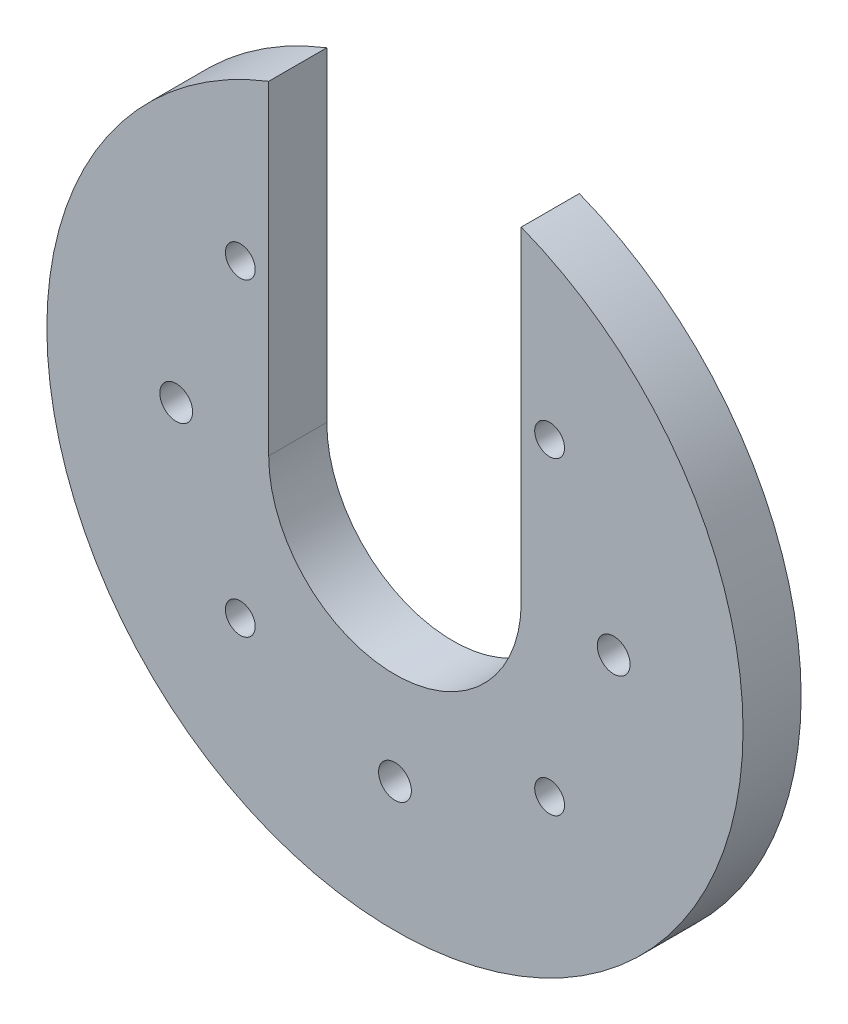
ISO-10303-21;
HEADER;
FILE_DESCRIPTION(('STEP AP214'),'2;1');
FILE_NAME('part.step','',(''),(''),'','','');
FILE_SCHEMA(('AUTOMOTIVE_DESIGN { 1 0 10303 214 1 1 1 1 }'));
ENDSEC;
DATA;
#1=APPLICATION_CONTEXT('core data for automotive mechanical design processes');
#2=APPLICATION_PROTOCOL_DEFINITION('international standard','automotive_design',2000,#1);
#3=PRODUCT_CONTEXT('',#1,'mechanical');
#4=PRODUCT('Part','Part','',(#3));
#5=PRODUCT_RELATED_PRODUCT_CATEGORY('part','',(#4));
#6=PRODUCT_DEFINITION_FORMATION('','',#4);
#7=PRODUCT_DEFINITION_CONTEXT('part definition',#1,'design');
#8=PRODUCT_DEFINITION('design','',#6,#7);
#9=PRODUCT_DEFINITION_SHAPE('','',#8);
#10=(LENGTH_UNIT() NAMED_UNIT(*) SI_UNIT(.MILLI.,.METRE.));
#11=(NAMED_UNIT(*) PLANE_ANGLE_UNIT() SI_UNIT($,.RADIAN.));
#12=(NAMED_UNIT(*) SI_UNIT($,.STERADIAN.) SOLID_ANGLE_UNIT());
#13=UNCERTAINTY_MEASURE_WITH_UNIT(LENGTH_MEASURE(1.E-05),#10,'distance_accuracy_value','');
#14=(GEOMETRIC_REPRESENTATION_CONTEXT(3) GLOBAL_UNCERTAINTY_ASSIGNED_CONTEXT((#13)) GLOBAL_UNIT_ASSIGNED_CONTEXT((#10,
#11,#12)) REPRESENTATION_CONTEXT('',''));
#15=CARTESIAN_POINT('',(0.,0.,0.));
#16=DIRECTION('',(0.,0.,1.));
#17=DIRECTION('',(1.,0.,0.));
#18=AXIS2_PLACEMENT_3D('',#15,#16,#17);
#19=CARTESIAN_POINT('',(0.,0.,5.842));
#20=DIRECTION('',(0.,0.,-1.));
#21=DIRECTION('',(-1.,0.,0.));
#22=AXIS2_PLACEMENT_3D('',#19,#20,#21);
#23=CYLINDRICAL_SURFACE('',#22,12.7);
#24=CARTESIAN_POINT('',(0.,0.,0.));
#25=DIRECTION('',(0.,0.,1.));
#26=DIRECTION('',(1.,0.,0.));
#27=AXIS2_PLACEMENT_3D('',#24,#25,#26);
#28=CIRCLE('',#27,12.7);
#29=CARTESIAN_POINT('',(-12.7,0.,0.));
#30=VERTEX_POINT('',#29);
#31=CARTESIAN_POINT('',(12.7,0.,0.));
#32=VERTEX_POINT('',#31);
#33=EDGE_CURVE('E106',#30,#32,#28,.T.);
#34=ORIENTED_EDGE('',*,*,#33,.F.);
#35=DIRECTION('',(0.,0.,-1.));
#36=VECTOR('',#35,1.);
#37=CARTESIAN_POINT('',(-12.7,0.,5.842));
#38=LINE('',#37,#36);
#39=CARTESIAN_POINT('',(-12.7,0.,5.842));
#40=VERTEX_POINT('',#39);
#41=EDGE_CURVE('E11',#40,#30,#38,.T.);
#42=ORIENTED_EDGE('',*,*,#41,.F.);
#43=CARTESIAN_POINT('',(0.,0.,5.842));
#44=DIRECTION('',(0.,0.,1.));
#45=DIRECTION('',(1.,0.,0.));
#46=AXIS2_PLACEMENT_3D('',#43,#44,#45);
#47=CIRCLE('',#46,12.7);
#48=CARTESIAN_POINT('',(12.7,0.,5.842));
#49=VERTEX_POINT('',#48);
#50=EDGE_CURVE('E90',#40,#49,#47,.T.);
#51=ORIENTED_EDGE('',*,*,#50,.T.);
#52=DIRECTION('',(0.,0.,-1.));
#53=VECTOR('',#52,1.);
#54=CARTESIAN_POINT('',(12.7,0.,5.842));
#55=LINE('',#54,#53);
#56=EDGE_CURVE('E52',#49,#32,#55,.T.);
#57=ORIENTED_EDGE('',*,*,#56,.T.);
#58=EDGE_LOOP('',(#34,#42,#51,#57));
#59=FACE_BOUND('',#58,.T.);
#60=ADVANCED_FACE('F35',(#59),#23,.F.);
#61=CARTESIAN_POINT('',(-12.7,0.,5.842));
#62=DIRECTION('',(-1.,0.,0.));
#63=DIRECTION('',(0.,0.,1.));
#64=AXIS2_PLACEMENT_3D('',#61,#62,#63);
#65=PLANE('',#64);
#66=DIRECTION('',(0.,1.,0.));
#67=VECTOR('',#66,1.);
#68=CARTESIAN_POINT('',(-12.7,0.,0.));
#69=LINE('',#68,#67);
#70=CARTESIAN_POINT('',(-12.7,32.6294834959121,0.));
#71=VERTEX_POINT('',#70);
#72=EDGE_CURVE('E95',#30,#71,#69,.T.);
#73=ORIENTED_EDGE('',*,*,#72,.T.);
#74=DIRECTION('',(0.,0.,-1.));
#75=VECTOR('',#74,1.);
#76=CARTESIAN_POINT('',(-12.7,32.6294834959121,5.842));
#77=LINE('',#76,#75);
#78=CARTESIAN_POINT('',(-12.7,32.6294834959121,5.842));
#79=VERTEX_POINT('',#78);
#80=EDGE_CURVE('E44',#79,#71,#77,.T.);
#81=ORIENTED_EDGE('',*,*,#80,.F.);
#82=DIRECTION('',(0.,1.,0.));
#83=VECTOR('',#82,1.);
#84=CARTESIAN_POINT('',(-12.7,0.,5.842));
#85=LINE('',#84,#83);
#86=EDGE_CURVE('E86',#40,#79,#85,.T.);
#87=ORIENTED_EDGE('',*,*,#86,.F.);
#88=ORIENTED_EDGE('',*,*,#41,.T.);
#89=EDGE_LOOP('',(#73,#81,#87,#88));
#90=FACE_BOUND('',#89,.T.);
#91=ADVANCED_FACE('F93',(#90),#65,.F.);
#92=CARTESIAN_POINT('',(0.,0.,5.842));
#93=DIRECTION('',(0.,0.,-1.));
#94=DIRECTION('',(-1.,0.,0.));
#95=AXIS2_PLACEMENT_3D('',#92,#93,#94);
#96=CYLINDRICAL_SURFACE('',#95,35.0139);
#97=CARTESIAN_POINT('',(0.,0.,0.));
#98=DIRECTION('',(0.,0.,1.));
#99=DIRECTION('',(1.,0.,0.));
#100=AXIS2_PLACEMENT_3D('',#97,#98,#99);
#101=CIRCLE('',#100,35.0139);
#102=CARTESIAN_POINT('',(12.7,32.6294834959121,0.));
#103=VERTEX_POINT('',#102);
#104=EDGE_CURVE('E103',#71,#103,#101,.T.);
#105=ORIENTED_EDGE('',*,*,#104,.T.);
#106=DIRECTION('',(0.,0.,-1.));
#107=VECTOR('',#106,1.);
#108=CARTESIAN_POINT('',(12.7,32.6294834959121,5.842));
#109=LINE('',#108,#107);
#110=CARTESIAN_POINT('',(12.7,32.6294834959121,5.842));
#111=VERTEX_POINT('',#110);
#112=EDGE_CURVE('E66',#111,#103,#109,.T.);
#113=ORIENTED_EDGE('',*,*,#112,.F.);
#114=CARTESIAN_POINT('',(0.,0.,5.842));
#115=DIRECTION('',(0.,0.,1.));
#116=DIRECTION('',(1.,0.,0.));
#117=AXIS2_PLACEMENT_3D('',#114,#115,#116);
#118=CIRCLE('',#117,35.0139);
#119=EDGE_CURVE('E78',#79,#111,#118,.T.);
#120=ORIENTED_EDGE('',*,*,#119,.F.);
#121=ORIENTED_EDGE('',*,*,#80,.T.);
#122=EDGE_LOOP('',(#105,#113,#120,#121));
#123=FACE_BOUND('',#122,.T.);
#124=ADVANCED_FACE('F80',(#123),#96,.T.);
#125=CARTESIAN_POINT('',(22.,0.,5.842));
#126=DIRECTION('',(0.,0.,-1.));
#127=DIRECTION('',(-1.,0.,0.));
#128=AXIS2_PLACEMENT_3D('',#125,#126,#127);
#129=CYLINDRICAL_SURFACE('',#128,1.65);
#130=CARTESIAN_POINT('',(22.,0.,5.842));
#131=DIRECTION('',(0.,0.,1.));
#132=DIRECTION('',(1.,0.,0.));
#133=AXIS2_PLACEMENT_3D('',#130,#131,#132);
#134=CIRCLE('',#133,1.65);
#135=CARTESIAN_POINT('',(23.65,0.,5.842));
#136=VERTEX_POINT('',#135);
#137=EDGE_CURVE('E120',#136,#136,#134,.T.);
#138=ORIENTED_EDGE('',*,*,#137,.T.);
#139=EDGE_LOOP('',(#138));
#140=FACE_BOUND('',#139,.T.);
#141=CARTESIAN_POINT('',(22.,0.,0.));
#142=DIRECTION('',(0.,0.,1.));
#143=DIRECTION('',(1.,0.,0.));
#144=AXIS2_PLACEMENT_3D('',#141,#142,#143);
#145=CIRCLE('',#144,1.65);
#146=CARTESIAN_POINT('',(23.65,0.,0.));
#147=VERTEX_POINT('',#146);
#148=EDGE_CURVE('E108',#147,#147,#145,.T.);
#149=ORIENTED_EDGE('',*,*,#148,.F.);
#150=EDGE_LOOP('',(#149));
#151=FACE_BOUND('',#150,.T.);
#152=ADVANCED_FACE('F178',(#140,#151),#129,.F.);
#153=CARTESIAN_POINT('',(0.,-22.,5.842));
#154=DIRECTION('',(0.,0.,-1.));
#155=DIRECTION('',(-1.,0.,0.));
#156=AXIS2_PLACEMENT_3D('',#153,#154,#155);
#157=CYLINDRICAL_SURFACE('',#156,1.65);
#158=CARTESIAN_POINT('',(0.,-22.,5.842));
#159=DIRECTION('',(0.,0.,1.));
#160=DIRECTION('',(1.,0.,0.));
#161=AXIS2_PLACEMENT_3D('',#158,#159,#160);
#162=CIRCLE('',#161,1.65);
#163=CARTESIAN_POINT('',(1.65,-22.,5.842));
#164=VERTEX_POINT('',#163);
#165=EDGE_CURVE('E123',#164,#164,#162,.T.);
#166=ORIENTED_EDGE('',*,*,#165,.T.);
#167=EDGE_LOOP('',(#166));
#168=FACE_BOUND('',#167,.T.);
#169=CARTESIAN_POINT('',(0.,-22.,0.));
#170=DIRECTION('',(0.,0.,1.));
#171=DIRECTION('',(1.,0.,0.));
#172=AXIS2_PLACEMENT_3D('',#169,#170,#171);
#173=CIRCLE('',#172,1.65);
#174=CARTESIAN_POINT('',(1.65,-22.,0.));
#175=VERTEX_POINT('',#174);
#176=EDGE_CURVE('E111',#175,#175,#173,.T.);
#177=ORIENTED_EDGE('',*,*,#176,.F.);
#178=EDGE_LOOP('',(#177));
#179=FACE_BOUND('',#178,.T.);
#180=ADVANCED_FACE('F181',(#168,#179),#157,.F.);
#181=CARTESIAN_POINT('',(-22.,0.,5.842));
#182=DIRECTION('',(0.,0.,-1.));
#183=DIRECTION('',(-1.,0.,0.));
#184=AXIS2_PLACEMENT_3D('',#181,#182,#183);
#185=CYLINDRICAL_SURFACE('',#184,1.65);
#186=CARTESIAN_POINT('',(-22.,0.,5.842));
#187=DIRECTION('',(0.,0.,1.));
#188=DIRECTION('',(1.,0.,0.));
#189=AXIS2_PLACEMENT_3D('',#186,#187,#188);
#190=CIRCLE('',#189,1.65);
#191=CARTESIAN_POINT('',(-20.35,0.,5.842));
#192=VERTEX_POINT('',#191);
#193=EDGE_CURVE('E102',#192,#192,#190,.T.);
#194=ORIENTED_EDGE('',*,*,#193,.T.);
#195=EDGE_LOOP('',(#194));
#196=FACE_BOUND('',#195,.T.);
#197=CARTESIAN_POINT('',(-22.,0.,0.));
#198=DIRECTION('',(0.,0.,1.));
#199=DIRECTION('',(1.,0.,0.));
#200=AXIS2_PLACEMENT_3D('',#197,#198,#199);
#201=CIRCLE('',#200,1.65);
#202=CARTESIAN_POINT('',(-20.35,0.,0.));
#203=VERTEX_POINT('',#202);
#204=EDGE_CURVE('E114',#203,#203,#201,.T.);
#205=ORIENTED_EDGE('',*,*,#204,.F.);
#206=EDGE_LOOP('',(#205));
#207=FACE_BOUND('',#206,.T.);
#208=ADVANCED_FACE('F37',(#196,#207),#185,.F.);
#209=CARTESIAN_POINT('',(12.7,0.,5.842));
#210=DIRECTION('',(-1.,0.,0.));
#211=DIRECTION('',(0.,0.,1.));
#212=AXIS2_PLACEMENT_3D('',#209,#210,#211);
#213=PLANE('',#212);
#214=DIRECTION('',(0.,1.,0.));
#215=VECTOR('',#214,1.);
#216=CARTESIAN_POINT('',(12.7,0.,0.));
#217=LINE('',#216,#215);
#218=EDGE_CURVE('E99',#32,#103,#217,.T.);
#219=ORIENTED_EDGE('',*,*,#218,.F.);
#220=ORIENTED_EDGE('',*,*,#56,.F.);
#221=DIRECTION('',(0.,1.,0.));
#222=VECTOR('',#221,1.);
#223=CARTESIAN_POINT('',(12.7,0.,5.842));
#224=LINE('',#223,#222);
#225=EDGE_CURVE('E85',#49,#111,#224,.T.);
#226=ORIENTED_EDGE('',*,*,#225,.T.);
#227=ORIENTED_EDGE('',*,*,#112,.T.);
#228=EDGE_LOOP('',(#219,#220,#226,#227));
#229=FACE_BOUND('',#228,.T.);
#230=ADVANCED_FACE('F164',(#229),#213,.T.);
#231=CARTESIAN_POINT('',(0.,0.,5.842));
#232=DIRECTION('',(0.,0.,1.));
#233=DIRECTION('',(1.,0.,0.));
#234=AXIS2_PLACEMENT_3D('',#231,#232,#233);
#235=PLANE('',#234);
#236=CARTESIAN_POINT('',(15.5563491861041,-15.556349186104,5.842));
#237=DIRECTION('',(0.,0.,1.));
#238=DIRECTION('',(1.,0.,0.));
#239=AXIS2_PLACEMENT_3D('',#236,#237,#238);
#240=CIRCLE('',#239,1.5);
#241=CARTESIAN_POINT('',(17.0563491861041,-15.556349186104,5.842));
#242=VERTEX_POINT('',#241);
#243=EDGE_CURVE('E146',#242,#242,#240,.T.);
#244=ORIENTED_EDGE('',*,*,#243,.F.);
#245=EDGE_LOOP('',(#244));
#246=FACE_BOUND('',#245,.T.);
#247=CARTESIAN_POINT('',(15.556349186104,15.5563491861041,5.842));
#248=DIRECTION('',(0.,0.,1.));
#249=DIRECTION('',(1.,0.,0.));
#250=AXIS2_PLACEMENT_3D('',#247,#248,#249);
#251=CIRCLE('',#250,1.5);
#252=CARTESIAN_POINT('',(17.056349186104,15.5563491861041,5.842));
#253=VERTEX_POINT('',#252);
#254=EDGE_CURVE('E140',#253,#253,#251,.T.);
#255=ORIENTED_EDGE('',*,*,#254,.F.);
#256=EDGE_LOOP('',(#255));
#257=FACE_BOUND('',#256,.T.);
#258=CARTESIAN_POINT('',(-15.5563491861041,15.556349186104,5.842));
#259=DIRECTION('',(0.,0.,1.));
#260=DIRECTION('',(1.,0.,0.));
#261=AXIS2_PLACEMENT_3D('',#258,#259,#260);
#262=CIRCLE('',#261,1.5);
#263=CARTESIAN_POINT('',(-14.0563491861041,15.556349186104,5.842));
#264=VERTEX_POINT('',#263);
#265=EDGE_CURVE('E134',#264,#264,#262,.T.);
#266=ORIENTED_EDGE('',*,*,#265,.F.);
#267=EDGE_LOOP('',(#266));
#268=FACE_BOUND('',#267,.T.);
#269=CARTESIAN_POINT('',(-15.556349186104,-15.5563491861041,5.842));
#270=DIRECTION('',(0.,0.,1.));
#271=DIRECTION('',(1.,0.,0.));
#272=AXIS2_PLACEMENT_3D('',#269,#270,#271);
#273=CIRCLE('',#272,1.5);
#274=CARTESIAN_POINT('',(-14.056349186104,-15.5563491861041,5.842));
#275=VERTEX_POINT('',#274);
#276=EDGE_CURVE('E128',#275,#275,#273,.T.);
#277=ORIENTED_EDGE('',*,*,#276,.F.);
#278=EDGE_LOOP('',(#277));
#279=FACE_BOUND('',#278,.T.);
#280=ORIENTED_EDGE('',*,*,#193,.F.);
#281=EDGE_LOOP('',(#280));
#282=FACE_BOUND('',#281,.T.);
#283=ORIENTED_EDGE('',*,*,#165,.F.);
#284=EDGE_LOOP('',(#283));
#285=FACE_BOUND('',#284,.T.);
#286=ORIENTED_EDGE('',*,*,#137,.F.);
#287=EDGE_LOOP('',(#286));
#288=FACE_BOUND('',#287,.T.);
#289=ORIENTED_EDGE('',*,*,#50,.F.);
#290=ORIENTED_EDGE('',*,*,#86,.T.);
#291=ORIENTED_EDGE('',*,*,#119,.T.);
#292=ORIENTED_EDGE('',*,*,#225,.F.);
#293=EDGE_LOOP('',(#289,#290,#291,#292));
#294=FACE_BOUND('',#293,.T.);
#295=ADVANCED_FACE('F89',(#246,#257,#268,#279,#282,#285,#288,#294),#235,.T.);
#296=CARTESIAN_POINT('',(0.,0.,0.));
#297=DIRECTION('',(0.,0.,1.));
#298=DIRECTION('',(1.,0.,0.));
#299=AXIS2_PLACEMENT_3D('',#296,#297,#298);
#300=PLANE('',#299);
#301=CARTESIAN_POINT('',(15.5563491861041,-15.556349186104,0.));
#302=DIRECTION('',(0.,0.,1.));
#303=DIRECTION('',(1.,0.,0.));
#304=AXIS2_PLACEMENT_3D('',#301,#302,#303);
#305=CIRCLE('',#304,1.5);
#306=CARTESIAN_POINT('',(17.0563491861041,-15.556349186104,0.));
#307=VERTEX_POINT('',#306);
#308=EDGE_CURVE('E143',#307,#307,#305,.T.);
#309=ORIENTED_EDGE('',*,*,#308,.T.);
#310=EDGE_LOOP('',(#309));
#311=FACE_BOUND('',#310,.T.);
#312=CARTESIAN_POINT('',(15.556349186104,15.5563491861041,0.));
#313=DIRECTION('',(0.,0.,1.));
#314=DIRECTION('',(1.,0.,0.));
#315=AXIS2_PLACEMENT_3D('',#312,#313,#314);
#316=CIRCLE('',#315,1.5);
#317=CARTESIAN_POINT('',(17.056349186104,15.5563491861041,0.));
#318=VERTEX_POINT('',#317);
#319=EDGE_CURVE('E137',#318,#318,#316,.T.);
#320=ORIENTED_EDGE('',*,*,#319,.T.);
#321=EDGE_LOOP('',(#320));
#322=FACE_BOUND('',#321,.T.);
#323=CARTESIAN_POINT('',(-15.5563491861041,15.556349186104,0.));
#324=DIRECTION('',(0.,0.,1.));
#325=DIRECTION('',(1.,0.,0.));
#326=AXIS2_PLACEMENT_3D('',#323,#324,#325);
#327=CIRCLE('',#326,1.5);
#328=CARTESIAN_POINT('',(-14.0563491861041,15.556349186104,0.));
#329=VERTEX_POINT('',#328);
#330=EDGE_CURVE('E131',#329,#329,#327,.T.);
#331=ORIENTED_EDGE('',*,*,#330,.T.);
#332=EDGE_LOOP('',(#331));
#333=FACE_BOUND('',#332,.T.);
#334=CARTESIAN_POINT('',(-15.556349186104,-15.5563491861041,0.));
#335=DIRECTION('',(0.,0.,1.));
#336=DIRECTION('',(1.,0.,0.));
#337=AXIS2_PLACEMENT_3D('',#334,#335,#336);
#338=CIRCLE('',#337,1.5);
#339=CARTESIAN_POINT('',(-14.056349186104,-15.5563491861041,0.));
#340=VERTEX_POINT('',#339);
#341=EDGE_CURVE('E117',#340,#340,#338,.T.);
#342=ORIENTED_EDGE('',*,*,#341,.T.);
#343=EDGE_LOOP('',(#342));
#344=FACE_BOUND('',#343,.T.);
#345=ORIENTED_EDGE('',*,*,#204,.T.);
#346=EDGE_LOOP('',(#345));
#347=FACE_BOUND('',#346,.T.);
#348=ORIENTED_EDGE('',*,*,#176,.T.);
#349=EDGE_LOOP('',(#348));
#350=FACE_BOUND('',#349,.T.);
#351=ORIENTED_EDGE('',*,*,#148,.T.);
#352=EDGE_LOOP('',(#351));
#353=FACE_BOUND('',#352,.T.);
#354=ORIENTED_EDGE('',*,*,#33,.T.);
#355=ORIENTED_EDGE('',*,*,#218,.T.);
#356=ORIENTED_EDGE('',*,*,#104,.F.);
#357=ORIENTED_EDGE('',*,*,#72,.F.);
#358=EDGE_LOOP('',(#354,#355,#356,#357));
#359=FACE_BOUND('',#358,.T.);
#360=ADVANCED_FACE('F152',(#311,#322,#333,#344,#347,#350,#353,#359),#300,.F.);
#361=CARTESIAN_POINT('',(-15.556349186104,-15.5563491861041,0.));
#362=DIRECTION('',(0.,0.,1.));
#363=DIRECTION('',(1.,0.,0.));
#364=AXIS2_PLACEMENT_3D('',#361,#362,#363);
#365=CYLINDRICAL_SURFACE('',#364,1.5);
#366=ORIENTED_EDGE('',*,*,#341,.F.);
#367=EDGE_LOOP('',(#366));
#368=FACE_BOUND('',#367,.T.);
#369=ORIENTED_EDGE('',*,*,#276,.T.);
#370=EDGE_LOOP('',(#369));
#371=FACE_BOUND('',#370,.T.);
#372=ADVANCED_FACE('F187',(#368,#371),#365,.F.);
#373=CARTESIAN_POINT('',(-15.5563491861041,15.556349186104,0.));
#374=DIRECTION('',(0.,0.,1.));
#375=DIRECTION('',(1.,0.,0.));
#376=AXIS2_PLACEMENT_3D('',#373,#374,#375);
#377=CYLINDRICAL_SURFACE('',#376,1.5);
#378=ORIENTED_EDGE('',*,*,#330,.F.);
#379=EDGE_LOOP('',(#378));
#380=FACE_BOUND('',#379,.T.);
#381=ORIENTED_EDGE('',*,*,#265,.T.);
#382=EDGE_LOOP('',(#381));
#383=FACE_BOUND('',#382,.T.);
#384=ADVANCED_FACE('F241',(#380,#383),#377,.F.);
#385=CARTESIAN_POINT('',(15.556349186104,15.5563491861041,0.));
#386=DIRECTION('',(0.,0.,1.));
#387=DIRECTION('',(1.,0.,0.));
#388=AXIS2_PLACEMENT_3D('',#385,#386,#387);
#389=CYLINDRICAL_SURFACE('',#388,1.5);
#390=ORIENTED_EDGE('',*,*,#319,.F.);
#391=EDGE_LOOP('',(#390));
#392=FACE_BOUND('',#391,.T.);
#393=ORIENTED_EDGE('',*,*,#254,.T.);
#394=EDGE_LOOP('',(#393));
#395=FACE_BOUND('',#394,.T.);
#396=ADVANCED_FACE('F158',(#392,#395),#389,.F.);
#397=CARTESIAN_POINT('',(15.5563491861041,-15.556349186104,0.));
#398=DIRECTION('',(0.,0.,1.));
#399=DIRECTION('',(1.,0.,0.));
#400=AXIS2_PLACEMENT_3D('',#397,#398,#399);
#401=CYLINDRICAL_SURFACE('',#400,1.5);
#402=ORIENTED_EDGE('',*,*,#308,.F.);
#403=EDGE_LOOP('',(#402));
#404=FACE_BOUND('',#403,.T.);
#405=ORIENTED_EDGE('',*,*,#243,.T.);
#406=EDGE_LOOP('',(#405));
#407=FACE_BOUND('',#406,.T.);
#408=ADVANCED_FACE('F155',(#404,#407),#401,.F.);
#409=CLOSED_SHELL('',(#60,#91,#124,#152,#180,#208,#230,#295,#360,#372,#384,#396,#408));
#410=MANIFOLD_SOLID_BREP('B2',#409);
#411=ADVANCED_BREP_SHAPE_REPRESENTATION('',(#18,#410),#14);
#412=SHAPE_DEFINITION_REPRESENTATION(#9,#411);
ENDSEC;
END-ISO-10303-21;
